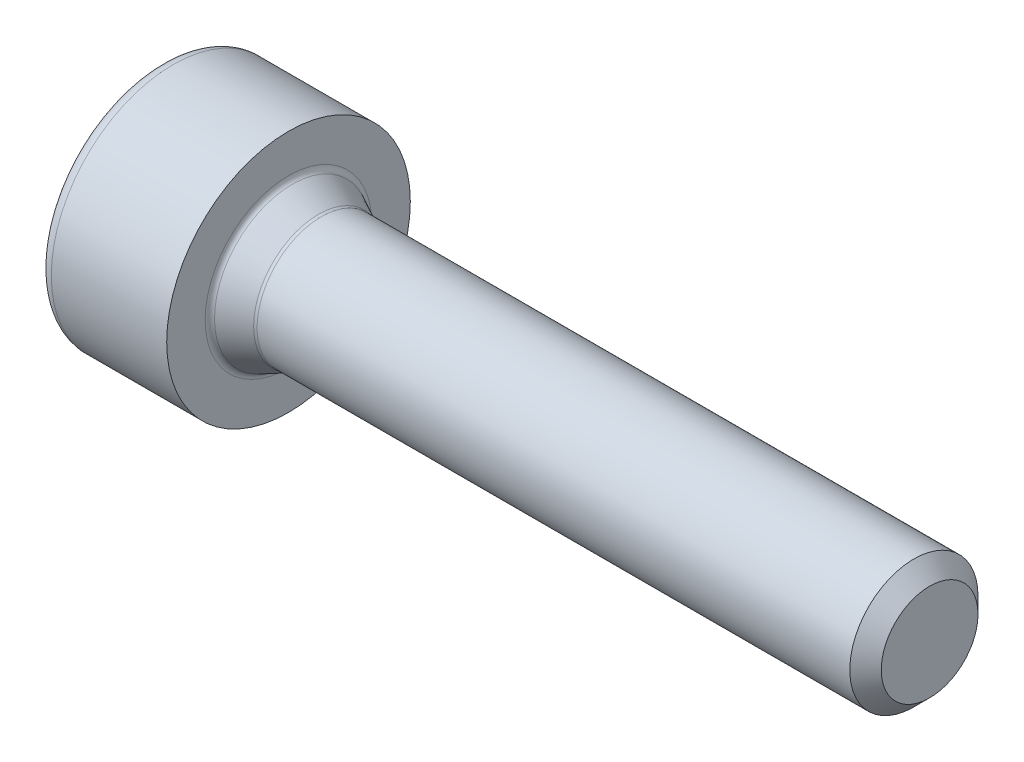
ISO-10303-21;
HEADER;
FILE_DESCRIPTION(('STEP AP214'),'2;1');
FILE_NAME('part.step','',(''),(''),'','','');
FILE_SCHEMA(('AUTOMOTIVE_DESIGN { 1 0 10303 214 1 1 1 1 }'));
ENDSEC;
DATA;
#1=APPLICATION_CONTEXT('core data for automotive mechanical design processes');
#2=APPLICATION_PROTOCOL_DEFINITION('international standard','automotive_design',2000,#1);
#3=PRODUCT_CONTEXT('',#1,'mechanical');
#4=PRODUCT('Part','Part','',(#3));
#5=PRODUCT_RELATED_PRODUCT_CATEGORY('part','',(#4));
#6=PRODUCT_DEFINITION_FORMATION('','',#4);
#7=PRODUCT_DEFINITION_CONTEXT('part definition',#1,'design');
#8=PRODUCT_DEFINITION('design','',#6,#7);
#9=PRODUCT_DEFINITION_SHAPE('','',#8);
#10=(LENGTH_UNIT() NAMED_UNIT(*) SI_UNIT(.MILLI.,.METRE.));
#11=(NAMED_UNIT(*) PLANE_ANGLE_UNIT() SI_UNIT($,.RADIAN.));
#12=(NAMED_UNIT(*) SI_UNIT($,.STERADIAN.) SOLID_ANGLE_UNIT());
#13=UNCERTAINTY_MEASURE_WITH_UNIT(LENGTH_MEASURE(1.E-05),#10,'distance_accuracy_value','');
#14=(GEOMETRIC_REPRESENTATION_CONTEXT(3) GLOBAL_UNCERTAINTY_ASSIGNED_CONTEXT((#13)) GLOBAL_UNIT_ASSIGNED_CONTEXT((#10,
#11,#12)) REPRESENTATION_CONTEXT('',''));
#15=CARTESIAN_POINT('',(0.,0.,0.));
#16=DIRECTION('',(0.,0.,1.));
#17=DIRECTION('',(1.,0.,0.));
#18=AXIS2_PLACEMENT_3D('',#15,#16,#17);
#19=CARTESIAN_POINT('',(-1.,0.75,0.));
#20=DIRECTION('',(-1.,0.,0.));
#21=DIRECTION('',(0.,0.,1.));
#22=AXIS2_PLACEMENT_3D('',#19,#20,#21);
#23=PLANE('',#22);
#24=DIRECTION('',(0.,1.,0.));
#25=VECTOR('',#24,1.);
#26=CARTESIAN_POINT('',(-1.,-0.43301270189222,-0.75));
#27=LINE('',#26,#25);
#28=CARTESIAN_POINT('',(-1.,0.,-0.75));
#29=VERTEX_POINT('',#28);
#30=CARTESIAN_POINT('',(-1.,0.43301270189222,-0.75));
#31=VERTEX_POINT('',#30);
#32=EDGE_CURVE('E226',#29,#31,#27,.T.);
#33=ORIENTED_EDGE('',*,*,#32,.F.);
#34=CARTESIAN_POINT('',(-1.,0.,0.));
#35=DIRECTION('',(1.,0.,0.));
#36=DIRECTION('',(0.,0.,-1.));
#37=AXIS2_PLACEMENT_3D('',#34,#35,#36);
#38=CIRCLE('',#37,0.75);
#39=CARTESIAN_POINT('',(-1.,0.649519052838329,-0.375));
#40=VERTEX_POINT('',#39);
#41=EDGE_CURVE('E64',#29,#40,#38,.T.);
#42=ORIENTED_EDGE('',*,*,#41,.T.);
#43=DIRECTION('',(0.,0.5,0.866025403784438));
#44=VECTOR('',#43,1.);
#45=CARTESIAN_POINT('',(-1.,0.43301270189222,-0.75));
#46=LINE('',#45,#44);
#47=EDGE_CURVE('E319',#31,#40,#46,.T.);
#48=ORIENTED_EDGE('',*,*,#47,.F.);
#49=EDGE_LOOP('',(#33,#42,#48));
#50=FACE_BOUND('',#49,.T.);
#51=ADVANCED_FACE('F49',(#50),#23,.T.);
#52=CARTESIAN_POINT('',(-1.,0.86602540378444,0.));
#53=VERTEX_POINT('',#52);
#54=EDGE_CURVE('E324',#40,#53,#46,.T.);
#55=ORIENTED_EDGE('',*,*,#54,.F.);
#56=CARTESIAN_POINT('',(-1.,0.649519052838329,0.375));
#57=VERTEX_POINT('',#56);
#58=EDGE_CURVE('E372',#40,#57,#38,.T.);
#59=ORIENTED_EDGE('',*,*,#58,.T.);
#60=DIRECTION('',(0.,-0.5,0.866025403784438));
#61=VECTOR('',#60,1.);
#62=CARTESIAN_POINT('',(-1.,0.86602540378444,0.));
#63=LINE('',#62,#61);
#64=EDGE_CURVE('E349',#53,#57,#63,.T.);
#65=ORIENTED_EDGE('',*,*,#64,.F.);
#66=EDGE_LOOP('',(#55,#59,#65));
#67=FACE_BOUND('',#66,.T.);
#68=ADVANCED_FACE('F157',(#67),#23,.T.);
#69=CARTESIAN_POINT('',(-1.,0.43301270189222,0.75));
#70=VERTEX_POINT('',#69);
#71=EDGE_CURVE('E352',#57,#70,#63,.T.);
#72=ORIENTED_EDGE('',*,*,#71,.F.);
#73=CARTESIAN_POINT('',(-1.,0.,0.75));
#74=VERTEX_POINT('',#73);
#75=EDGE_CURVE('E370',#57,#74,#38,.T.);
#76=ORIENTED_EDGE('',*,*,#75,.T.);
#77=DIRECTION('',(0.,-1.,0.));
#78=VECTOR('',#77,1.);
#79=CARTESIAN_POINT('',(-1.,0.43301270189222,0.75));
#80=LINE('',#79,#78);
#81=EDGE_CURVE('E425',#70,#74,#80,.T.);
#82=ORIENTED_EDGE('',*,*,#81,.F.);
#83=EDGE_LOOP('',(#72,#76,#82));
#84=FACE_BOUND('',#83,.T.);
#85=ADVANCED_FACE('F165',(#84),#23,.T.);
#86=CARTESIAN_POINT('',(-1.,-0.43301270189222,0.75));
#87=VERTEX_POINT('',#86);
#88=EDGE_CURVE('E234',#74,#87,#80,.T.);
#89=ORIENTED_EDGE('',*,*,#88,.F.);
#90=CARTESIAN_POINT('',(-1.,-0.649519052838329,0.375));
#91=VERTEX_POINT('',#90);
#92=EDGE_CURVE('E368',#74,#91,#38,.T.);
#93=ORIENTED_EDGE('',*,*,#92,.T.);
#94=DIRECTION('',(0.,-0.5,-0.866025403784438));
#95=VECTOR('',#94,1.);
#96=CARTESIAN_POINT('',(-1.,-0.43301270189222,0.75));
#97=LINE('',#96,#95);
#98=EDGE_CURVE('E233',#87,#91,#97,.T.);
#99=ORIENTED_EDGE('',*,*,#98,.F.);
#100=EDGE_LOOP('',(#89,#93,#99));
#101=FACE_BOUND('',#100,.T.);
#102=ADVANCED_FACE('F180',(#101),#23,.T.);
#103=CARTESIAN_POINT('',(-1.,-0.86602540378444,0.));
#104=VERTEX_POINT('',#103);
#105=EDGE_CURVE('E229',#91,#104,#97,.T.);
#106=ORIENTED_EDGE('',*,*,#105,.F.);
#107=CARTESIAN_POINT('',(-1.,-0.649519052838329,-0.375));
#108=VERTEX_POINT('',#107);
#109=EDGE_CURVE('E358',#91,#108,#38,.T.);
#110=ORIENTED_EDGE('',*,*,#109,.T.);
#111=DIRECTION('',(0.,0.5,-0.866025403784438));
#112=VECTOR('',#111,1.);
#113=CARTESIAN_POINT('',(-1.,-0.86602540378444,0.));
#114=LINE('',#113,#112);
#115=EDGE_CURVE('E193',#104,#108,#114,.T.);
#116=ORIENTED_EDGE('',*,*,#115,.F.);
#117=EDGE_LOOP('',(#106,#110,#116));
#118=FACE_BOUND('',#117,.T.);
#119=ADVANCED_FACE('F172',(#118),#23,.T.);
#120=CARTESIAN_POINT('',(-1.,-0.43301270189222,-0.75));
#121=VERTEX_POINT('',#120);
#122=EDGE_CURVE('E184',#108,#121,#114,.T.);
#123=ORIENTED_EDGE('',*,*,#122,.F.);
#124=EDGE_CURVE('E186',#108,#29,#38,.T.);
#125=ORIENTED_EDGE('',*,*,#124,.T.);
#126=EDGE_CURVE('E188',#121,#29,#27,.T.);
#127=ORIENTED_EDGE('',*,*,#126,.F.);
#128=EDGE_LOOP('',(#123,#125,#127));
#129=FACE_BOUND('',#128,.T.);
#130=ADVANCED_FACE('F160',(#129),#23,.T.);
#131=CARTESIAN_POINT('',(-1.,0.43301270189222,0.75));
#132=DIRECTION('',(0.,0.,-1.));
#133=DIRECTION('',(-1.,0.,0.));
#134=AXIS2_PLACEMENT_3D('',#131,#132,#133);
#135=PLANE('',#134);
#136=CARTESIAN_POINT('',(-1.9220577136594,0.,0.75));
#137=CARTESIAN_POINT('',(-1.92205133920084,-0.0182418992289258,0.749994320075201));
#138=CARTESIAN_POINT('',(-1.92242967178421,-0.0364836758869528,0.749978901295454));
#139=CARTESIAN_POINT('',(-1.9239431956468,-0.0728563689054629,0.749951120624183));
#140=CARTESIAN_POINT('',(-1.92507508779841,-0.0909874223512979,0.749938745728368));
#141=CARTESIAN_POINT('',(-1.92809444191564,-0.127321423906745,0.749939149830352));
#142=CARTESIAN_POINT('',(-1.92998744131216,-0.145523908998688,0.749952115925717));
#143=CARTESIAN_POINT('',(-1.93451605565744,-0.182176720417588,0.749980862568039));
#144=CARTESIAN_POINT('',(-1.93716473520708,-0.200625418374292,0.749996690654761));
#145=CARTESIAN_POINT('',(-1.9429893121686,-0.236592576827268,0.750003161367553));
#146=CARTESIAN_POINT('',(-1.94613633910868,-0.254115745920557,0.749994898516581));
#147=CARTESIAN_POINT('',(-1.95304816814584,-0.289305947509605,0.749984457018174));
#148=CARTESIAN_POINT('',(-1.95682133722655,-0.306971332358423,0.749982369181434));
#149=CARTESIAN_POINT('',(-1.96497980269943,-0.342546598853564,0.749983826916089));
#150=CARTESIAN_POINT('',(-1.96937620516181,-0.360453916547788,0.74998749064416));
#151=CARTESIAN_POINT('',(-1.97877957707816,-0.396602974535322,0.749995090901478));
#152=CARTESIAN_POINT('',(-1.98379940102567,-0.414841379506779,0.74999903203643));
#153=CARTESIAN_POINT('',(-1.98904501176718,-0.43301270189222,0.75));
#154=B_SPLINE_CURVE_WITH_KNOTS('',3,(#136,#137,#138,#139,#140,#141,#142,#143,#144,#145,#146,
#147,#148,#149,#150,#151,#152,#153),.UNSPECIFIED.,.F.,.F.,(4,2,2,2,2,2,2,2,4),(0.,
0.0547213468907554,0.109204682321536,0.164091798900995,0.219992213096894,0.273393034968801,
0.327575366142894,0.382885433408072,0.439626581200787),.UNSPECIFIED.);
#155=CARTESIAN_POINT('',(-1.9220577136594,0.,0.75));
#156=VERTEX_POINT('',#155);
#157=CARTESIAN_POINT('',(-1.98904501176718,-0.43301270189222,0.75));
#158=VERTEX_POINT('',#157);
#159=EDGE_CURVE('E637',#156,#158,#154,.T.);
#160=ORIENTED_EDGE('',*,*,#159,.F.);
#161=CARTESIAN_POINT('',(-1.98904501176718,0.43301270189222,0.75));
#162=CARTESIAN_POINT('',(-1.98379342184594,0.414820664549898,0.749999029364647));
#163=CARTESIAN_POINT('',(-1.97876812385102,0.396561389046234,0.749995064463578));
#164=CARTESIAN_POINT('',(-1.96935531535196,0.360371360323698,0.74998741837503));
#165=CARTESIAN_POINT('',(-1.96495490428146,0.342443953924261,0.749983732551572));
#166=CARTESIAN_POINT('',(-1.95678992753736,0.306828946166496,0.74998227109318));
#167=CARTESIAN_POINT('',(-1.95301421912864,0.289143916433684,0.7499843763894));
#168=CARTESIAN_POINT('',(-1.94609880001638,0.253914479757752,0.74999486143655));
#169=CARTESIAN_POINT('',(-1.9429507016034,0.236371723607891,0.750003150251286));
#170=CARTESIAN_POINT('',(-1.93713217104211,0.200405430920242,0.749996709652443));
#171=CARTESIAN_POINT('',(-1.93448920743727,0.181977419289447,0.749980940191791));
#172=CARTESIAN_POINT('',(-1.92997034671581,0.145365203374335,0.749952306990701));
#173=CARTESIAN_POINT('',(-1.9280814383135,0.127182619120296,0.749939395846457));
#174=CARTESIAN_POINT('',(-1.92506858945834,0.0908881746840528,0.749938995652053));
#175=CARTESIAN_POINT('',(-1.92393913591397,0.072776774982894,0.749951320699562));
#176=CARTESIAN_POINT('',(-1.92242888121272,0.0364437151184284,0.749978988314118));
#177=CARTESIAN_POINT('',(-1.92205136630082,0.0182219185508415,0.749994343805749));
#178=CARTESIAN_POINT('',(-1.9220577136594,0.,0.75));
#179=B_SPLINE_CURVE_WITH_KNOTS('',3,(#161,#162,#163,#164,#165,#166,#167,#168,#169,#170,#171,
#172,#173,#174,#175,#176,#177,#178),.UNSPECIFIED.,.F.,.F.,(4,2,2,2,2,2,2,2,4),(0.,
0.0568058387298274,0.112177274737997,0.166418798018618,0.219877980532877,0.275714570887395,
0.330541080836817,0.384965164735478,0.439626584285712),.UNSPECIFIED.);
#180=CARTESIAN_POINT('',(-1.98904501176718,0.43301270189222,0.75));
#181=VERTEX_POINT('',#180);
#182=EDGE_CURVE('E610',#181,#156,#179,.T.);
#183=ORIENTED_EDGE('',*,*,#182,.F.);
#184=DIRECTION('',(-1.,0.,0.));
#185=VECTOR('',#184,1.);
#186=CARTESIAN_POINT('',(-1.,0.43301270189222,0.75));
#187=LINE('',#186,#185);
#188=EDGE_CURVE('E355',#70,#181,#187,.T.);
#189=ORIENTED_EDGE('',*,*,#188,.F.);
#190=ORIENTED_EDGE('',*,*,#81,.T.);
#191=ORIENTED_EDGE('',*,*,#88,.T.);
#192=DIRECTION('',(-1.,0.,0.));
#193=VECTOR('',#192,1.);
#194=CARTESIAN_POINT('',(-1.,-0.43301270189222,0.75));
#195=LINE('',#194,#193);
#196=EDGE_CURVE('E744',#87,#158,#195,.T.);
#197=ORIENTED_EDGE('',*,*,#196,.T.);
#198=EDGE_LOOP('',(#160,#183,#189,#190,#191,#197));
#199=FACE_BOUND('',#198,.T.);
#200=ADVANCED_FACE('F171',(#199),#135,.T.);
#201=CARTESIAN_POINT('',(-1.,0.86602540378444,0.));
#202=DIRECTION('',(0.,-0.866025403784439,-0.5));
#203=DIRECTION('',(0.,0.5,-0.866025403784439));
#204=AXIS2_PLACEMENT_3D('',#201,#202,#203);
#205=PLANE('',#204);
#206=CARTESIAN_POINT('',(-1.98904501176718,0.86602540378444,0.));
#207=CARTESIAN_POINT('',(-1.98379363715122,0.856928917566077,0.0157536352225909));
#208=CARTESIAN_POINT('',(-1.97876853626308,0.847796222618926,0.0315639987943785));
#209=CARTESIAN_POINT('',(-1.96935606751535,0.829695325638359,0.0629003831582561));
#210=CARTESIAN_POINT('',(-1.96495580075047,0.82072879279349,0.0784235035612088));
#211=CARTESIAN_POINT('',(-1.95679105835617,0.802920738878994,0.109265035077007));
#212=CARTESIAN_POINT('',(-1.95301544131322,0.794080400395738,0.124581159818349));
#213=CARTESIAN_POINT('',(-1.94610015129774,0.776475467415133,0.155094765155716));
#214=CARTESIAN_POINT('',(-1.94295209136214,0.767711619508668,0.170290770755058));
#215=CARTESIAN_POINT('',(-1.93713334305952,0.749722878927327,0.201435300038161));
#216=CARTESIAN_POINT('',(-1.93449017373259,0.740494842100619,0.217387185539154));
#217=CARTESIAN_POINT('',(-1.9299709619678,0.722163202644902,0.249081241902298));
#218=CARTESIAN_POINT('',(-1.92808190632707,0.713060369123775,0.264821985813142));
#219=CARTESIAN_POINT('',(-1.92506882334053,0.694912087995641,0.296254930127364));
#220=CARTESIAN_POINT('',(-1.92393928202816,0.68586670964141,0.311946638690893));
#221=CARTESIAN_POINT('',(-1.922428909667,0.667723430507536,0.343427063327003));
#222=CARTESIAN_POINT('',(-1.92205136532649,0.658625472709011,0.359215904014082));
#223=CARTESIAN_POINT('',(-1.9220577136594,0.64951905283833,0.375000000000001));
#224=B_SPLINE_CURVE_WITH_KNOTS('',3,(#206,#207,#208,#209,#210,#211,#212,#213,#214,#215,#216,
#217,#218,#219,#220,#221,#222,#223),.UNSPECIFIED.,.F.,.F.,(4,2,2,2,2,2,2,2,4),(0.,
0.0568035092620566,0.112172735506326,0.166412127422059,0.219869208465582,0.275708096902452,
0.330536789198474,0.384963006702155,0.439626584176175),.UNSPECIFIED.);
#225=CARTESIAN_POINT('',(-1.98904501176718,0.86602540378444,0.));
#226=VERTEX_POINT('',#225);
#227=CARTESIAN_POINT('',(-1.9220577136594,0.649250887701807,0.375464092581976));
#228=VERTEX_POINT('',#227);
#229=EDGE_CURVE('E334',#226,#228,#224,.T.);
#230=ORIENTED_EDGE('',*,*,#229,.F.);
#231=DIRECTION('',(-1.,0.,0.));
#232=VECTOR('',#231,1.);
#233=CARTESIAN_POINT('',(-1.,0.86602540378444,0.));
#234=LINE('',#233,#232);
#235=EDGE_CURVE('E328',#53,#226,#234,.T.);
#236=ORIENTED_EDGE('',*,*,#235,.F.);
#237=ORIENTED_EDGE('',*,*,#64,.T.);
#238=ORIENTED_EDGE('',*,*,#71,.T.);
#239=ORIENTED_EDGE('',*,*,#188,.T.);
#240=CARTESIAN_POINT('',(-1.92205815603157,0.648983021777792,0.375928433031288));
#241=CARTESIAN_POINT('',(-1.92206686955442,0.639880296660385,0.391683578887792));
#242=CARTESIAN_POINT('',(-1.92245834665028,0.630769469626196,0.407433525144848));
#243=CARTESIAN_POINT('',(-1.92399405035619,0.612604984188406,0.438840441500908));
#244=CARTESIAN_POINT('',(-1.92513507532874,0.603551247258924,0.454497522514446));
#245=CARTESIAN_POINT('',(-1.92816859684969,0.585429251460499,0.48588654451781));
#246=CARTESIAN_POINT('',(-1.93006662522792,0.57636138636686,0.501618174919626));
#247=CARTESIAN_POINT('',(-1.93460135557513,0.55810480492439,0.533296308321236));
#248=CARTESIAN_POINT('',(-1.93725102286387,0.548916940128971,0.549241429981678));
#249=CARTESIAN_POINT('',(-1.94307406323133,0.53098330795113,0.580316180969866));
#250=CARTESIAN_POINT('',(-1.94621874359954,0.522236131405486,0.595450412005956));
#251=CARTESIAN_POINT('',(-1.95312268219774,0.504675120073145,0.625846349585334));
#252=CARTESIAN_POINT('',(-1.95689026151934,0.49586218334392,0.64110668006374));
#253=CARTESIAN_POINT('',(-1.96503441987283,0.47811937429215,0.671841006343515));
#254=CARTESIAN_POINT('',(-1.96942202500293,0.469190876422207,0.687312854470456));
#255=CARTESIAN_POINT('',(-1.97880469587913,0.451167770594438,0.718544800684321));
#256=CARTESIAN_POINT('',(-1.98381251549813,0.442074821673036,0.734302034322303));
#257=CARTESIAN_POINT('',(-1.98904501176718,0.433012701892221,0.75));
#258=B_SPLINE_CURVE_WITH_KNOTS('',3,(#240,#241,#242,#243,#244,#245,#246,#247,#248,#249,#250,
#251,#252,#253,#254,#255,#256,#257),.UNSPECIFIED.,.F.,.F.,(4,2,2,2,2,2,2,2,4),(0.,
0.0545828218375264,0.108934000137744,0.163689850243938,0.219454544356847,0.272727378729136,
0.326779889823758,0.381955367980234,0.438554656492645),.UNSPECIFIED.);
#259=EDGE_CURVE('E653',#228,#181,#258,.T.);
#260=ORIENTED_EDGE('',*,*,#259,.F.);
#261=EDGE_LOOP('',(#230,#236,#237,#238,#239,#260));
#262=FACE_BOUND('',#261,.T.);
#263=ADVANCED_FACE('F178',(#262),#205,.T.);
#264=CARTESIAN_POINT('',(-1.,0.43301270189222,-0.75));
#265=DIRECTION('',(0.,-0.866025403784439,0.5));
#266=DIRECTION('',(0.,-0.5,-0.866025403784439));
#267=AXIS2_PLACEMENT_3D('',#264,#265,#266);
#268=PLANE('',#267);
#269=CARTESIAN_POINT('',(-1.98904501176718,0.43301270189222,-0.75));
#270=CARTESIAN_POINT('',(-1.98379363715122,0.442107507087756,-0.734245394238428));
#271=CARTESIAN_POINT('',(-1.97876853626308,0.451233336110416,-0.718431066623287));
#272=CARTESIAN_POINT('',(-1.96935606751535,0.469320992542004,-0.687087037824892));
#273=CARTESIAN_POINT('',(-1.96495580075047,0.478281142734531,-0.671560232395892));
#274=CARTESIAN_POINT('',(-1.95679105835617,0.496086665561582,-0.640717239556076));
#275=CARTESIAN_POINT('',(-1.95301544131322,0.504930649433488,-0.625403219480852));
#276=CARTESIAN_POINT('',(-1.94610015129774,0.522553740326398,-0.594900097619042));
#277=CARTESIAN_POINT('',(-1.94295209136214,0.531331943258245,-0.579712379897469));
#278=CARTESIAN_POINT('',(-1.93713334305952,0.549309526515651,-0.548561408930389));
#279=CARTESIAN_POINT('',(-1.93449017373259,0.558510246184418,-0.532593751860905));
#280=CARTESIAN_POINT('',(-1.9299709619678,0.576792284416018,-0.500871058217665));
#281=CARTESIAN_POINT('',(-1.92808190632707,0.58587275175671,-0.485117401186526));
#282=CARTESIAN_POINT('',(-1.92506882334053,0.604020339484501,-0.45368405653743));
#283=CARTESIAN_POINT('',(-1.92393928202816,0.613087068552183,-0.43800467481406));
#284=CARTESIAN_POINT('',(-1.922428909667,0.631278276442039,-0.406551921858117));
#285=CARTESIAN_POINT('',(-1.92205136532649,0.640402834674093,-0.390778438938496));
#286=CARTESIAN_POINT('',(-1.9220577136594,0.64951905283833,-0.375));
#287=B_SPLINE_CURVE_WITH_KNOTS('',3,(#269,#270,#271,#272,#273,#274,#275,#276,#277,#278,#279,
#280,#281,#282,#283,#284,#285,#286),.UNSPECIFIED.,.F.,.F.,(4,2,2,2,2,2,2,2,4),(0.,
0.0568035092620565,0.112172735506326,0.166412127422059,0.219869208465582,0.275708096902452,
0.330536789198473,0.384963006702154,0.439626584176175),.UNSPECIFIED.);
#288=CARTESIAN_POINT('',(-1.98904501176718,0.43301270189222,-0.75));
#289=VERTEX_POINT('',#288);
#290=CARTESIAN_POINT('',(-1.9220577136594,0.649786886235767,-0.374535715888374));
#291=VERTEX_POINT('',#290);
#292=EDGE_CURVE('E311',#289,#291,#287,.T.);
#293=ORIENTED_EDGE('',*,*,#292,.F.);
#294=DIRECTION('',(-1.,0.,0.));
#295=VECTOR('',#294,1.);
#296=CARTESIAN_POINT('',(-1.,0.43301270189222,-0.75));
#297=LINE('',#296,#295);
#298=EDGE_CURVE('E307',#31,#289,#297,.T.);
#299=ORIENTED_EDGE('',*,*,#298,.F.);
#300=ORIENTED_EDGE('',*,*,#47,.T.);
#301=ORIENTED_EDGE('',*,*,#54,.T.);
#302=ORIENTED_EDGE('',*,*,#235,.T.);
#303=CARTESIAN_POINT('',(-1.92205815603157,0.650055083898868,-0.374071566968713));
#304=CARTESIAN_POINT('',(-1.922066869545,0.659148086910529,-0.358310787182321));
#305=CARTESIAN_POINT('',(-1.92245834739407,0.668232535947278,-0.342545590713231));
#306=CARTESIAN_POINT('',(-1.92399405408057,0.686349498485596,-0.311111195599691));
#307=CARTESIAN_POINT('',(-1.92513508126912,0.695382068779274,-0.295441873492005));
#308=CARTESIAN_POINT('',(-1.92816860869103,0.713504779231856,-0.264053222770251));
#309=CARTESIAN_POINT('',(-1.93006664077624,0.722594847301082,-0.248334390472143));
#310=CARTESIAN_POINT('',(-1.93460137995581,0.740900643301191,-0.216684628701243));
#311=CARTESIAN_POINT('',(-1.93725105241791,0.750115600730148,-0.200755127371596));
#312=CARTESIAN_POINT('',(-1.94307409823869,0.768060308828512,-0.16968677016404));
#313=CARTESIAN_POINT('',(-1.94621877762286,0.776793340260534,-0.154544392902341));
#314=CARTESIAN_POINT('',(-1.95312271294843,0.79433647099645,-0.124138172941204));
#315=CARTESIAN_POINT('',(-1.9568902899627,0.803145827623266,-0.108875796012262));
#316=CARTESIAN_POINT('',(-1.96503444240995,0.820891112443932,-0.0781429406345469));
#317=CARTESIAN_POINT('',(-1.96942204390817,0.829825867926221,-0.0626747263274682));
#318=CARTESIAN_POINT('',(-1.97880470624084,0.847861955276115,-0.0314503177957919));
#319=CARTESIAN_POINT('',(-1.98381252090682,0.856961635981524,-0.0156969925543926));
#320=CARTESIAN_POINT('',(-1.98904501176718,0.866025403784439,0.));
#321=B_SPLINE_CURVE_WITH_KNOTS('',3,(#303,#304,#305,#306,#307,#308,#309,#310,#311,#312,#313,
#314,#315,#316,#317,#318,#319,#320),.UNSPECIFIED.,.F.,.F.,(4,2,2,2,2,2,2,2,4),(0.,
0.054582876044759,0.108934107953741,0.163690012897695,0.219454764752402,0.272727546325767,
0.326780003862886,0.381955426495743,0.438554656489762),.UNSPECIFIED.);
#322=EDGE_CURVE('E248',#291,#226,#321,.T.);
#323=ORIENTED_EDGE('',*,*,#322,.F.);
#324=EDGE_LOOP('',(#293,#299,#300,#301,#302,#323));
#325=FACE_BOUND('',#324,.T.);
#326=ADVANCED_FACE('F261',(#325),#268,.T.);
#327=CARTESIAN_POINT('',(-1.,-0.43301270189222,-0.75));
#328=DIRECTION('',(0.,0.,1.));
#329=DIRECTION('',(1.,0.,0.));
#330=AXIS2_PLACEMENT_3D('',#327,#328,#329);
#331=PLANE('',#330);
#332=CARTESIAN_POINT('',(-1.9220577136594,0.,-0.75));
#333=CARTESIAN_POINT('',(-1.92205133920084,0.0182418992289256,-0.749994320075201));
#334=CARTESIAN_POINT('',(-1.92242967178421,0.0364836758869525,-0.749978901295454));
#335=CARTESIAN_POINT('',(-1.9239431956468,0.0728563689054626,-0.749951120624183));
#336=CARTESIAN_POINT('',(-1.92507508779841,0.0909874223512977,-0.749938745728368));
#337=CARTESIAN_POINT('',(-1.92809444191564,0.127321423906745,-0.749939149830352));
#338=CARTESIAN_POINT('',(-1.92998744131216,0.145523908998688,-0.749952115925717));
#339=CARTESIAN_POINT('',(-1.93451605565744,0.182176720417588,-0.749980862568039));
#340=CARTESIAN_POINT('',(-1.93716473520708,0.200625418374292,-0.749996690654761));
#341=CARTESIAN_POINT('',(-1.9429893121686,0.236592576827268,-0.750003161367553));
#342=CARTESIAN_POINT('',(-1.94613633910868,0.254115745920557,-0.749994898516581));
#343=CARTESIAN_POINT('',(-1.95304816814584,0.289305947509605,-0.749984457018174));
#344=CARTESIAN_POINT('',(-1.95682133722655,0.306971332358423,-0.749982369181434));
#345=CARTESIAN_POINT('',(-1.96497980269944,0.342546598853564,-0.749983826916089));
#346=CARTESIAN_POINT('',(-1.96937620516182,0.360453916547788,-0.74998749064416));
#347=CARTESIAN_POINT('',(-1.97877957707816,0.396602974535322,-0.749995090901477));
#348=CARTESIAN_POINT('',(-1.98379940102567,0.414841379506779,-0.74999903203643));
#349=CARTESIAN_POINT('',(-1.98904501176718,0.43301270189222,-0.75));
#350=B_SPLINE_CURVE_WITH_KNOTS('',3,(#332,#333,#334,#335,#336,#337,#338,#339,#340,#341,#342,
#343,#344,#345,#346,#347,#348,#349),.UNSPECIFIED.,.F.,.F.,(4,2,2,2,2,2,2,2,4),(0.,
0.0547213468907551,0.109204682321536,0.164091798900995,0.219992213096894,0.273393034968801,
0.327575366142894,0.382885433408072,0.439626581200787),.UNSPECIFIED.);
#351=CARTESIAN_POINT('',(-1.9220577136594,0.,-0.75));
#352=VERTEX_POINT('',#351);
#353=EDGE_CURVE('E298',#352,#289,#350,.T.);
#354=ORIENTED_EDGE('',*,*,#353,.F.);
#355=CARTESIAN_POINT('',(-1.98904501176718,-0.43301270189222,-0.75));
#356=CARTESIAN_POINT('',(-1.98379342184594,-0.414820664549898,-0.749999029364647));
#357=CARTESIAN_POINT('',(-1.97876812385102,-0.396561389046234,-0.749995064463579));
#358=CARTESIAN_POINT('',(-1.96935531535196,-0.360371360323698,-0.74998741837503));
#359=CARTESIAN_POINT('',(-1.96495490428146,-0.342443953924261,-0.749983732551572));
#360=CARTESIAN_POINT('',(-1.95678992753736,-0.306828946166495,-0.74998227109318));
#361=CARTESIAN_POINT('',(-1.95301421912864,-0.289143916433683,-0.7499843763894));
#362=CARTESIAN_POINT('',(-1.94609880001638,-0.253914479757752,-0.749994861436551));
#363=CARTESIAN_POINT('',(-1.9429507016034,-0.236371723607891,-0.750003150251286));
#364=CARTESIAN_POINT('',(-1.93713217104211,-0.200405430920242,-0.749996709652443));
#365=CARTESIAN_POINT('',(-1.93448920743727,-0.181977419289446,-0.749980940191791));
#366=CARTESIAN_POINT('',(-1.92997034671581,-0.145365203374335,-0.749952306990701));
#367=CARTESIAN_POINT('',(-1.9280814383135,-0.127182619120295,-0.749939395846457));
#368=CARTESIAN_POINT('',(-1.92506858945834,-0.0908881746840522,-0.749938995652053));
#369=CARTESIAN_POINT('',(-1.92393913591397,-0.0727767749828934,-0.749951320699562));
#370=CARTESIAN_POINT('',(-1.92242888121272,-0.0364437151184281,-0.749978988314118));
#371=CARTESIAN_POINT('',(-1.92205136630082,-0.0182219185508413,-0.749994343805749));
#372=CARTESIAN_POINT('',(-1.9220577136594,0.,-0.75));
#373=B_SPLINE_CURVE_WITH_KNOTS('',3,(#355,#356,#357,#358,#359,#360,#361,#362,#363,#364,#365,
#366,#367,#368,#369,#370,#371,#372),.UNSPECIFIED.,.F.,.F.,(4,2,2,2,2,2,2,2,4),(0.,
0.0568058387298273,0.112177274737997,0.166418798018619,0.219877980532877,0.275714570887396,
0.330541080836817,0.384965164735478,0.439626584285712),.UNSPECIFIED.);
#374=CARTESIAN_POINT('',(-1.98904501176718,-0.433012701892221,-0.75));
#375=VERTEX_POINT('',#374);
#376=EDGE_CURVE('E296',#375,#352,#373,.T.);
#377=ORIENTED_EDGE('',*,*,#376,.F.);
#378=DIRECTION('',(-1.,0.,0.));
#379=VECTOR('',#378,1.);
#380=CARTESIAN_POINT('',(-1.,-0.43301270189222,-0.75));
#381=LINE('',#380,#379);
#382=EDGE_CURVE('E194',#121,#375,#381,.T.);
#383=ORIENTED_EDGE('',*,*,#382,.F.);
#384=ORIENTED_EDGE('',*,*,#126,.T.);
#385=ORIENTED_EDGE('',*,*,#32,.T.);
#386=ORIENTED_EDGE('',*,*,#298,.T.);
#387=EDGE_LOOP('',(#354,#377,#383,#384,#385,#386));
#388=FACE_BOUND('',#387,.T.);
#389=ADVANCED_FACE('F271',(#388),#331,.T.);
#390=CARTESIAN_POINT('',(-1.,-0.86602540378444,0.));
#391=DIRECTION('',(0.,0.866025403784439,0.5));
#392=DIRECTION('',(0.,-0.5,0.866025403784439));
#393=AXIS2_PLACEMENT_3D('',#390,#391,#392);
#394=PLANE('',#393);
#395=CARTESIAN_POINT('',(-1.98904501176718,-0.86602540378444,0.));
#396=CARTESIAN_POINT('',(-1.98379363715122,-0.856928917566078,-0.0157536352225908));
#397=CARTESIAN_POINT('',(-1.97876853626308,-0.847796222618926,-0.0315639987943782));
#398=CARTESIAN_POINT('',(-1.96935606751535,-0.829695325638359,-0.0629003831582555));
#399=CARTESIAN_POINT('',(-1.96495580075047,-0.82072879279349,-0.078423503561208));
#400=CARTESIAN_POINT('',(-1.95679105835617,-0.802920738878994,-0.109265035077006));
#401=CARTESIAN_POINT('',(-1.95301544131322,-0.794080400395738,-0.124581159818349));
#402=CARTESIAN_POINT('',(-1.94610015129774,-0.776475467415133,-0.155094765155717));
#403=CARTESIAN_POINT('',(-1.94295209136214,-0.767711619508668,-0.170290770755058));
#404=CARTESIAN_POINT('',(-1.93713334305952,-0.749722878927327,-0.201435300038161));
#405=CARTESIAN_POINT('',(-1.93449017373259,-0.740494842100619,-0.217387185539155));
#406=CARTESIAN_POINT('',(-1.9299709619678,-0.722163202644902,-0.249081241902298));
#407=CARTESIAN_POINT('',(-1.92808190632707,-0.713060369123775,-0.264821985813142));
#408=CARTESIAN_POINT('',(-1.92506882334053,-0.694912087995641,-0.296254930127364));
#409=CARTESIAN_POINT('',(-1.92393928202816,-0.68586670964141,-0.311946638690893));
#410=CARTESIAN_POINT('',(-1.922428909667,-0.667723430507536,-0.343427063327003));
#411=CARTESIAN_POINT('',(-1.92205136532649,-0.658625472709011,-0.359215904014082));
#412=CARTESIAN_POINT('',(-1.9220577136594,-0.64951905283833,-0.375));
#413=B_SPLINE_CURVE_WITH_KNOTS('',3,(#395,#396,#397,#398,#399,#400,#401,#402,#403,#404,#405,
#406,#407,#408,#409,#410,#411,#412),.UNSPECIFIED.,.F.,.F.,(4,2,2,2,2,2,2,2,4),(0.,
0.0568035092620562,0.112172735506325,0.166412127422059,0.219869208465582,0.275708096902453,
0.330536789198474,0.384963006702155,0.439626584176175),.UNSPECIFIED.);
#414=CARTESIAN_POINT('',(-1.98904501176718,-0.866025403784439,0.));
#415=VERTEX_POINT('',#414);
#416=CARTESIAN_POINT('',(-1.9220577136594,-0.649250887701807,-0.375464092581976));
#417=VERTEX_POINT('',#416);
#418=EDGE_CURVE('E212',#415,#417,#413,.T.);
#419=ORIENTED_EDGE('',*,*,#418,.F.);
#420=DIRECTION('',(-1.,0.,0.));
#421=VECTOR('',#420,1.);
#422=CARTESIAN_POINT('',(-1.,-0.86602540378444,0.));
#423=LINE('',#422,#421);
#424=EDGE_CURVE('E201',#104,#415,#423,.T.);
#425=ORIENTED_EDGE('',*,*,#424,.F.);
#426=ORIENTED_EDGE('',*,*,#115,.T.);
#427=ORIENTED_EDGE('',*,*,#122,.T.);
#428=ORIENTED_EDGE('',*,*,#382,.T.);
#429=CARTESIAN_POINT('',(-1.92205815603157,-0.648983021777791,-0.375928433031288));
#430=CARTESIAN_POINT('',(-1.92206686955442,-0.639880296660385,-0.391683578887793));
#431=CARTESIAN_POINT('',(-1.92245834665028,-0.630769469626196,-0.407433525144849));
#432=CARTESIAN_POINT('',(-1.92399405035619,-0.612604984188405,-0.438840441500908));
#433=CARTESIAN_POINT('',(-1.92513507532874,-0.603551247258923,-0.454497522514446));
#434=CARTESIAN_POINT('',(-1.92816859684969,-0.585429251460499,-0.48588654451781));
#435=CARTESIAN_POINT('',(-1.93006662522792,-0.576361386366859,-0.501618174919626));
#436=CARTESIAN_POINT('',(-1.93460135557513,-0.55810480492439,-0.533296308321236));
#437=CARTESIAN_POINT('',(-1.93725102286387,-0.548916940128971,-0.549241429981678));
#438=CARTESIAN_POINT('',(-1.94307406323133,-0.53098330795113,-0.580316180969866));
#439=CARTESIAN_POINT('',(-1.94621874359954,-0.522236131405486,-0.595450412005957));
#440=CARTESIAN_POINT('',(-1.95312268219774,-0.504675120073145,-0.625846349585334));
#441=CARTESIAN_POINT('',(-1.95689026151934,-0.49586218334392,-0.64110668006374));
#442=CARTESIAN_POINT('',(-1.96503441987283,-0.47811937429215,-0.671841006343515));
#443=CARTESIAN_POINT('',(-1.96942202500293,-0.469190876422207,-0.687312854470456));
#444=CARTESIAN_POINT('',(-1.97880469587913,-0.451167770594437,-0.718544800684321));
#445=CARTESIAN_POINT('',(-1.98381251549813,-0.442074821673036,-0.734302034322303));
#446=CARTESIAN_POINT('',(-1.98904501176718,-0.433012701892221,-0.75));
#447=B_SPLINE_CURVE_WITH_KNOTS('',3,(#429,#430,#431,#432,#433,#434,#435,#436,#437,#438,#439,
#440,#441,#442,#443,#444,#445,#446),.UNSPECIFIED.,.F.,.F.,(4,2,2,2,2,2,2,2,4),(0.,
0.0545828218375263,0.108934000137744,0.163689850243938,0.219454544356847,0.272727378729136,
0.326779889823757,0.381955367980233,0.438554656492644),.UNSPECIFIED.);
#448=EDGE_CURVE('E205',#417,#375,#447,.T.);
#449=ORIENTED_EDGE('',*,*,#448,.F.);
#450=EDGE_LOOP('',(#419,#425,#426,#427,#428,#449));
#451=FACE_BOUND('',#450,.T.);
#452=ADVANCED_FACE('F199',(#451),#394,.T.);
#453=CARTESIAN_POINT('',(-1.,-0.43301270189222,0.75));
#454=DIRECTION('',(0.,0.866025403784439,-0.5));
#455=DIRECTION('',(0.,0.5,0.866025403784439));
#456=AXIS2_PLACEMENT_3D('',#453,#454,#455);
#457=PLANE('',#456);
#458=CARTESIAN_POINT('',(-1.98904501176718,-0.43301270189222,0.75));
#459=CARTESIAN_POINT('',(-1.98379363715122,-0.442107507087756,0.734245394238428));
#460=CARTESIAN_POINT('',(-1.97876853626308,-0.451233336110416,0.718431066623287));
#461=CARTESIAN_POINT('',(-1.96935606751535,-0.469320992542004,0.687087037824892));
#462=CARTESIAN_POINT('',(-1.96495580075047,-0.478281142734531,0.671560232395892));
#463=CARTESIAN_POINT('',(-1.95679105835617,-0.496086665561582,0.640717239556077));
#464=CARTESIAN_POINT('',(-1.95301544131322,-0.504930649433488,0.625403219480852));
#465=CARTESIAN_POINT('',(-1.94610015129774,-0.522553740326398,0.594900097619042));
#466=CARTESIAN_POINT('',(-1.94295209136214,-0.531331943258246,0.57971237989747));
#467=CARTESIAN_POINT('',(-1.93713334305952,-0.549309526515651,0.548561408930389));
#468=CARTESIAN_POINT('',(-1.93449017373259,-0.558510246184418,0.532593751860905));
#469=CARTESIAN_POINT('',(-1.9299709619678,-0.576792284416018,0.500871058217665));
#470=CARTESIAN_POINT('',(-1.92808190632707,-0.58587275175671,0.485117401186526));
#471=CARTESIAN_POINT('',(-1.92506882334053,-0.604020339484502,0.45368405653743));
#472=CARTESIAN_POINT('',(-1.92393928202816,-0.613087068552184,0.43800467481406));
#473=CARTESIAN_POINT('',(-1.922428909667,-0.631278276442039,0.406551921858117));
#474=CARTESIAN_POINT('',(-1.92205136532649,-0.640402834674093,0.390778438938496));
#475=CARTESIAN_POINT('',(-1.9220577136594,-0.64951905283833,0.375));
#476=B_SPLINE_CURVE_WITH_KNOTS('',3,(#458,#459,#460,#461,#462,#463,#464,#465,#466,#467,#468,
#469,#470,#471,#472,#473,#474,#475),.UNSPECIFIED.,.F.,.F.,(4,2,2,2,2,2,2,2,4),(0.,
0.056803509262057,0.112172735506326,0.166412127422059,0.219869208465582,0.275708096902452,
0.330536789198474,0.384963006702155,0.439626584176175),.UNSPECIFIED.);
#477=CARTESIAN_POINT('',(-1.9220577136594,-0.64978688600908,0.374535716281657));
#478=VERTEX_POINT('',#477);
#479=EDGE_CURVE('E72',#158,#478,#476,.T.);
#480=ORIENTED_EDGE('',*,*,#479,.F.);
#481=ORIENTED_EDGE('',*,*,#196,.F.);
#482=ORIENTED_EDGE('',*,*,#98,.T.);
#483=ORIENTED_EDGE('',*,*,#105,.T.);
#484=ORIENTED_EDGE('',*,*,#424,.T.);
#485=CARTESIAN_POINT('',(-1.92205815603157,-0.650055083898867,0.374071566968713));
#486=CARTESIAN_POINT('',(-1.922066869545,-0.659148086910528,0.358310787182322));
#487=CARTESIAN_POINT('',(-1.92245834739407,-0.668232535947278,0.342545590713232));
#488=CARTESIAN_POINT('',(-1.92399405408057,-0.686349498485596,0.311111195599692));
#489=CARTESIAN_POINT('',(-1.92513508126912,-0.695382068779274,0.295441873492005));
#490=CARTESIAN_POINT('',(-1.92816860869103,-0.713504779231856,0.264053222770251));
#491=CARTESIAN_POINT('',(-1.93006664077624,-0.722594847301082,0.248334390472143));
#492=CARTESIAN_POINT('',(-1.93460137995581,-0.740900643301191,0.216684628701243));
#493=CARTESIAN_POINT('',(-1.93725105241791,-0.750115600730148,0.200755127371596));
#494=CARTESIAN_POINT('',(-1.94307409823869,-0.768060308828512,0.16968677016404));
#495=CARTESIAN_POINT('',(-1.94621877762286,-0.776793340260534,0.154544392902341));
#496=CARTESIAN_POINT('',(-1.95312271294843,-0.79433647099645,0.124138172941204));
#497=CARTESIAN_POINT('',(-1.9568902899627,-0.803145827623266,0.108875796012262));
#498=CARTESIAN_POINT('',(-1.96503444240995,-0.820891112443932,0.0781429406345474));
#499=CARTESIAN_POINT('',(-1.96942204390817,-0.829825867926221,0.0626747263274685));
#500=CARTESIAN_POINT('',(-1.97880470624084,-0.847861955276115,0.0314503177957922));
#501=CARTESIAN_POINT('',(-1.98381252090682,-0.856961635981524,0.0156969925543929));
#502=CARTESIAN_POINT('',(-1.98904501176718,-0.866025403784439,0.));
#503=B_SPLINE_CURVE_WITH_KNOTS('',3,(#485,#486,#487,#488,#489,#490,#491,#492,#493,#494,#495,
#496,#497,#498,#499,#500,#501,#502),.UNSPECIFIED.,.F.,.F.,(4,2,2,2,2,2,2,2,4),(0.,
0.0545828760447593,0.108934107953741,0.163690012897695,0.219454764752402,0.272727546325767,
0.326780003862886,0.381955426495743,0.438554656489762),.UNSPECIFIED.);
#504=EDGE_CURVE('E750',#478,#415,#503,.T.);
#505=ORIENTED_EDGE('',*,*,#504,.F.);
#506=EDGE_LOOP('',(#480,#481,#482,#483,#484,#505));
#507=FACE_BOUND('',#506,.T.);
#508=ADVANCED_FACE('F670',(#507),#457,.T.);
#509=CARTESIAN_POINT('',(-1.9220577136594,0.,0.));
#510=DIRECTION('',(-1.,0.,0.));
#511=DIRECTION('',(0.,0.,1.));
#512=AXIS2_PLACEMENT_3D('',#509,#510,#511);
#513=CONICAL_SURFACE('',#512,0.75,1.0471975511966);
#514=ORIENTED_EDGE('',*,*,#292,.T.);
#515=ORIENTED_EDGE('',*,*,#322,.T.);
#516=ORIENTED_EDGE('',*,*,#229,.T.);
#517=ORIENTED_EDGE('',*,*,#259,.T.);
#518=ORIENTED_EDGE('',*,*,#182,.T.);
#519=ORIENTED_EDGE('',*,*,#159,.T.);
#520=ORIENTED_EDGE('',*,*,#479,.T.);
#521=ORIENTED_EDGE('',*,*,#504,.T.);
#522=ORIENTED_EDGE('',*,*,#418,.T.);
#523=ORIENTED_EDGE('',*,*,#448,.T.);
#524=ORIENTED_EDGE('',*,*,#376,.T.);
#525=ORIENTED_EDGE('',*,*,#353,.T.);
#526=EDGE_LOOP('',(#514,#515,#516,#517,#518,#519,#520,#521,#522,#523,#524,#525));
#527=FACE_BOUND('',#526,.T.);
#528=CARTESIAN_POINT('',(-2.,0.,0.));
#529=DIRECTION('',(1.,0.,0.));
#530=DIRECTION('',(0.,0.,-1.));
#531=AXIS2_PLACEMENT_3D('',#528,#529,#530);
#532=CIRCLE('',#531,0.885);
#533=CARTESIAN_POINT('',(-2.,0.,-0.885));
#534=VERTEX_POINT('',#533);
#535=EDGE_CURVE('E418',#534,#534,#532,.T.);
#536=ORIENTED_EDGE('',*,*,#535,.F.);
#537=EDGE_LOOP('',(#536));
#538=FACE_BOUND('',#537,.T.);
#539=ADVANCED_FACE('F651',(#527,#538),#513,.F.);
#540=CARTESIAN_POINT('',(-2.,0.,0.));
#541=DIRECTION('',(1.,0.,0.));
#542=DIRECTION('',(0.,0.,-1.));
#543=AXIS2_PLACEMENT_3D('',#540,#541,#542);
#544=PLANE('',#543);
#545=CARTESIAN_POINT('',(-2.,0.,0.));
#546=DIRECTION('',(1.,0.,0.));
#547=DIRECTION('',(0.,0.,-1.));
#548=AXIS2_PLACEMENT_3D('',#545,#546,#547);
#549=CIRCLE('',#548,1.69999999999997);
#550=CARTESIAN_POINT('',(-2.,0.,-1.69999999999997));
#551=VERTEX_POINT('',#550);
#552=EDGE_CURVE('E57',#551,#551,#549,.F.);
#553=ORIENTED_EDGE('',*,*,#552,.T.);
#554=EDGE_LOOP('',(#553));
#555=FACE_BOUND('',#554,.T.);
#556=ORIENTED_EDGE('',*,*,#535,.T.);
#557=EDGE_LOOP('',(#556));
#558=FACE_BOUND('',#557,.T.);
#559=ADVANCED_FACE('F395',(#555,#558),#544,.F.);
#560=CARTESIAN_POINT('',(0.,0.,-1.9));
#561=DIRECTION('',(-1.,0.,0.));
#562=DIRECTION('',(0.,0.,1.));
#563=AXIS2_PLACEMENT_3D('',#560,#561,#562);
#564=PLANE('',#563);
#565=CARTESIAN_POINT('',(0.,0.,0.));
#566=DIRECTION('',(-1.,0.,0.));
#567=DIRECTION('',(0.,0.,1.));
#568=AXIS2_PLACEMENT_3D('',#565,#566,#567);
#569=CIRCLE('',#568,1.29999999999997);
#570=CARTESIAN_POINT('',(0.,0.,1.29999999999997));
#571=VERTEX_POINT('',#570);
#572=EDGE_CURVE('E384',#571,#571,#569,.T.);
#573=ORIENTED_EDGE('',*,*,#572,.T.);
#574=EDGE_LOOP('',(#573));
#575=FACE_BOUND('',#574,.T.);
#576=CARTESIAN_POINT('',(0.,0.,0.));
#577=DIRECTION('',(1.,0.,0.));
#578=DIRECTION('',(0.,0.,-1.));
#579=AXIS2_PLACEMENT_3D('',#576,#577,#578);
#580=CIRCLE('',#579,1.9);
#581=CARTESIAN_POINT('',(0.,0.,-1.9));
#582=VERTEX_POINT('',#581);
#583=EDGE_CURVE('E415',#582,#582,#580,.T.);
#584=ORIENTED_EDGE('',*,*,#583,.T.);
#585=EDGE_LOOP('',(#584));
#586=FACE_BOUND('',#585,.T.);
#587=ADVANCED_FACE('F411',(#575,#586),#564,.F.);
#588=CARTESIAN_POINT('',(10.,0.,0.));
#589=DIRECTION('',(1.,0.,0.));
#590=DIRECTION('',(0.,-1.,0.));
#591=AXIS2_PLACEMENT_3D('',#588,#589,#590);
#592=CYLINDRICAL_SURFACE('',#591,1.9);
#593=CARTESIAN_POINT('',(-1.79999999999997,0.,0.));
#594=DIRECTION('',(1.,0.,0.));
#595=DIRECTION('',(0.,0.,-1.));
#596=AXIS2_PLACEMENT_3D('',#593,#594,#595);
#597=CIRCLE('',#596,1.9);
#598=CARTESIAN_POINT('',(-1.79999999999997,0.,-1.9));
#599=VERTEX_POINT('',#598);
#600=EDGE_CURVE('E13',#599,#599,#597,.T.);
#601=ORIENTED_EDGE('',*,*,#600,.T.);
#602=EDGE_LOOP('',(#601));
#603=FACE_BOUND('',#602,.T.);
#604=ORIENTED_EDGE('',*,*,#583,.F.);
#605=EDGE_LOOP('',(#604));
#606=FACE_BOUND('',#605,.T.);
#607=ADVANCED_FACE('F407',(#603,#606),#592,.T.);
#608=CARTESIAN_POINT('',(0.,0.,0.));
#609=DIRECTION('',(-1.,0.,0.));
#610=DIRECTION('',(0.,0.,-1.));
#611=AXIS2_PLACEMENT_3D('',#608,#609,#610);
#612=CONICAL_SURFACE('',#611,1.2375171246053,0.453844001521528);
#613=CARTESIAN_POINT('',(0.466157636797853,0.,0.));
#614=DIRECTION('',(-1.,0.,0.));
#615=DIRECTION('',(0.,0.,1.));
#616=AXIS2_PLACEMENT_3D('',#613,#614,#615);
#617=CIRCLE('',#616,1.01012315543561);
#618=CARTESIAN_POINT('',(0.466157636797853,0.,1.01012315543561));
#619=VERTEX_POINT('',#618);
#620=EDGE_CURVE('E381',#619,#619,#617,.T.);
#621=ORIENTED_EDGE('',*,*,#620,.T.);
#622=EDGE_LOOP('',(#621));
#623=FACE_BOUND('',#622,.T.);
#624=CARTESIAN_POINT('',(0.0561576367978316,0.,0.));
#625=DIRECTION('',(-1.,0.,0.));
#626=DIRECTION('',(0.,0.,1.));
#627=AXIS2_PLACEMENT_3D('',#624,#625,#626);
#628=CIRCLE('',#627,1.21012315543563);
#629=CARTESIAN_POINT('',(0.0561576367978316,0.,1.21012315543563));
#630=VERTEX_POINT('',#629);
#631=EDGE_CURVE('E378',#630,#630,#628,.F.);
#632=ORIENTED_EDGE('',*,*,#631,.T.);
#633=EDGE_LOOP('',(#632));
#634=FACE_BOUND('',#633,.T.);
#635=ADVANCED_FACE('F410',(#623,#634),#612,.T.);
#636=CARTESIAN_POINT('',(10.,0.,0.));
#637=DIRECTION('',(-1.,0.,0.));
#638=DIRECTION('',(0.,0.,1.));
#639=AXIS2_PLACEMENT_3D('',#636,#637,#638);
#640=CYLINDRICAL_SURFACE('',#639,1.);
#641=CARTESIAN_POINT('',(9.7545,0.,0.));
#642=DIRECTION('',(1.,0.,0.));
#643=DIRECTION('',(0.,0.,-1.));
#644=AXIS2_PLACEMENT_3D('',#641,#642,#643);
#645=CIRCLE('',#644,1.);
#646=CARTESIAN_POINT('',(9.7545,0.,-1.));
#647=VERTEX_POINT('',#646);
#648=EDGE_CURVE('E390',#647,#647,#645,.F.);
#649=ORIENTED_EDGE('',*,*,#648,.T.);
#650=EDGE_LOOP('',(#649));
#651=FACE_BOUND('',#650,.T.);
#652=CARTESIAN_POINT('',(0.509999999999976,0.,0.));
#653=DIRECTION('',(1.,0.,0.));
#654=DIRECTION('',(0.,0.,-1.));
#655=AXIS2_PLACEMENT_3D('',#652,#653,#654);
#656=CIRCLE('',#655,1.);
#657=CARTESIAN_POINT('',(0.509999999999976,0.,-1.));
#658=VERTEX_POINT('',#657);
#659=EDGE_CURVE('E375',#658,#658,#656,.T.);
#660=ORIENTED_EDGE('',*,*,#659,.T.);
#661=EDGE_LOOP('',(#660));
#662=FACE_BOUND('',#661,.T.);
#663=ADVANCED_FACE('F152',(#651,#662),#640,.T.);
#664=CARTESIAN_POINT('',(10.,0.,0.));
#665=DIRECTION('',(1.,0.,0.));
#666=DIRECTION('',(0.,0.,-1.));
#667=AXIS2_PLACEMENT_3D('',#664,#665,#666);
#668=PLANE('',#667);
#669=CARTESIAN_POINT('',(10.,0.,0.));
#670=DIRECTION('',(1.,0.,0.));
#671=DIRECTION('',(0.,0.,-1.));
#672=AXIS2_PLACEMENT_3D('',#669,#670,#671);
#673=CIRCLE('',#672,0.754500000000002);
#674=CARTESIAN_POINT('',(10.,0.,-0.754500000000002));
#675=VERTEX_POINT('',#674);
#676=EDGE_CURVE('E387',#675,#675,#673,.T.);
#677=ORIENTED_EDGE('',*,*,#676,.T.);
#678=EDGE_LOOP('',(#677));
#679=FACE_BOUND('',#678,.T.);
#680=ADVANCED_FACE('F143',(#679),#668,.T.);
#681=CARTESIAN_POINT('',(-0.56698729810778,0.,0.));
#682=DIRECTION('',(-1.,0.,0.));
#683=DIRECTION('',(0.,0.,1.));
#684=AXIS2_PLACEMENT_3D('',#681,#682,#683);
#685=CONICAL_SURFACE('',#684,0.,1.0471975511966);
#686=ORIENTED_EDGE('',*,*,#41,.F.);
#687=ORIENTED_EDGE('',*,*,#124,.F.);
#688=ORIENTED_EDGE('',*,*,#109,.F.);
#689=ORIENTED_EDGE('',*,*,#92,.F.);
#690=ORIENTED_EDGE('',*,*,#75,.F.);
#691=ORIENTED_EDGE('',*,*,#58,.F.);
#692=EDGE_LOOP('',(#686,#687,#688,#689,#690,#691));
#693=FACE_BOUND('',#692,.T.);
#694=CARTESIAN_POINT('',(-0.56698729810778,0.,0.));
#695=VERTEX_POINT('',#694);
#696=VERTEX_LOOP('',#695);
#697=FACE_BOUND('',#696,.T.);
#698=ADVANCED_FACE('F140',(#693,#697),#685,.F.);
#699=CARTESIAN_POINT('',(0.509999999999976,0.,0.));
#700=DIRECTION('',(1.,0.,0.));
#701=DIRECTION('',(0.,0.,-1.));
#702=AXIS2_PLACEMENT_3D('',#699,#700,#701);
#703=TOROIDAL_SURFACE('',#702,1.09999999999995,0.0999999999999546);
#704=ORIENTED_EDGE('',*,*,#620,.F.);
#705=EDGE_LOOP('',(#704));
#706=FACE_BOUND('',#705,.T.);
#707=ORIENTED_EDGE('',*,*,#659,.F.);
#708=EDGE_LOOP('',(#707));
#709=FACE_BOUND('',#708,.T.);
#710=ADVANCED_FACE('F142',(#706,#709),#703,.F.);
#711=CARTESIAN_POINT('',(0.0999999999999546,0.,0.));
#712=DIRECTION('',(-1.,0.,0.));
#713=DIRECTION('',(0.,0.,1.));
#714=AXIS2_PLACEMENT_3D('',#711,#712,#713);
#715=TOROIDAL_SURFACE('',#714,1.29999999999997,0.0999999999999546);
#716=ORIENTED_EDGE('',*,*,#572,.F.);
#717=EDGE_LOOP('',(#716));
#718=FACE_BOUND('',#717,.T.);
#719=ORIENTED_EDGE('',*,*,#631,.F.);
#720=EDGE_LOOP('',(#719));
#721=FACE_BOUND('',#720,.T.);
#722=ADVANCED_FACE('F149',(#718,#721),#715,.F.);
#723=CARTESIAN_POINT('',(10.,0.,0.));
#724=DIRECTION('',(-1.,0.,0.));
#725=DIRECTION('',(0.,0.,1.));
#726=AXIS2_PLACEMENT_3D('',#723,#724,#725);
#727=CONICAL_SURFACE('',#726,0.754500000000002,0.785398163397443);
#728=ORIENTED_EDGE('',*,*,#648,.F.);
#729=EDGE_LOOP('',(#728));
#730=FACE_BOUND('',#729,.T.);
#731=ORIENTED_EDGE('',*,*,#676,.F.);
#732=EDGE_LOOP('',(#731));
#733=FACE_BOUND('',#732,.T.);
#734=ADVANCED_FACE('F399',(#730,#733),#727,.T.);
#735=CARTESIAN_POINT('',(-1.79999999999997,0.,0.));
#736=DIRECTION('',(1.,0.,0.));
#737=DIRECTION('',(0.,0.,-1.));
#738=AXIS2_PLACEMENT_3D('',#735,#736,#737);
#739=TOROIDAL_SURFACE('',#738,1.69999999999997,0.200000000000033);
#740=ORIENTED_EDGE('',*,*,#600,.F.);
#741=EDGE_LOOP('',(#740));
#742=FACE_BOUND('',#741,.T.);
#743=ORIENTED_EDGE('',*,*,#552,.F.);
#744=EDGE_LOOP('',(#743));
#745=FACE_BOUND('',#744,.T.);
#746=ADVANCED_FACE('F51',(#742,#745),#739,.T.);
#747=CLOSED_SHELL('',(#51,#68,#85,#102,#119,#130,#200,#263,#326,#389,#452,#508,#539,#559,#587,
#607,#635,#663,#680,#698,#710,#722,#734,#746));
#748=MANIFOLD_SOLID_BREP('B2',#747);
#749=ADVANCED_BREP_SHAPE_REPRESENTATION('',(#18,#748),#14);
#750=SHAPE_DEFINITION_REPRESENTATION(#9,#749);
ENDSEC;
END-ISO-10303-21;
